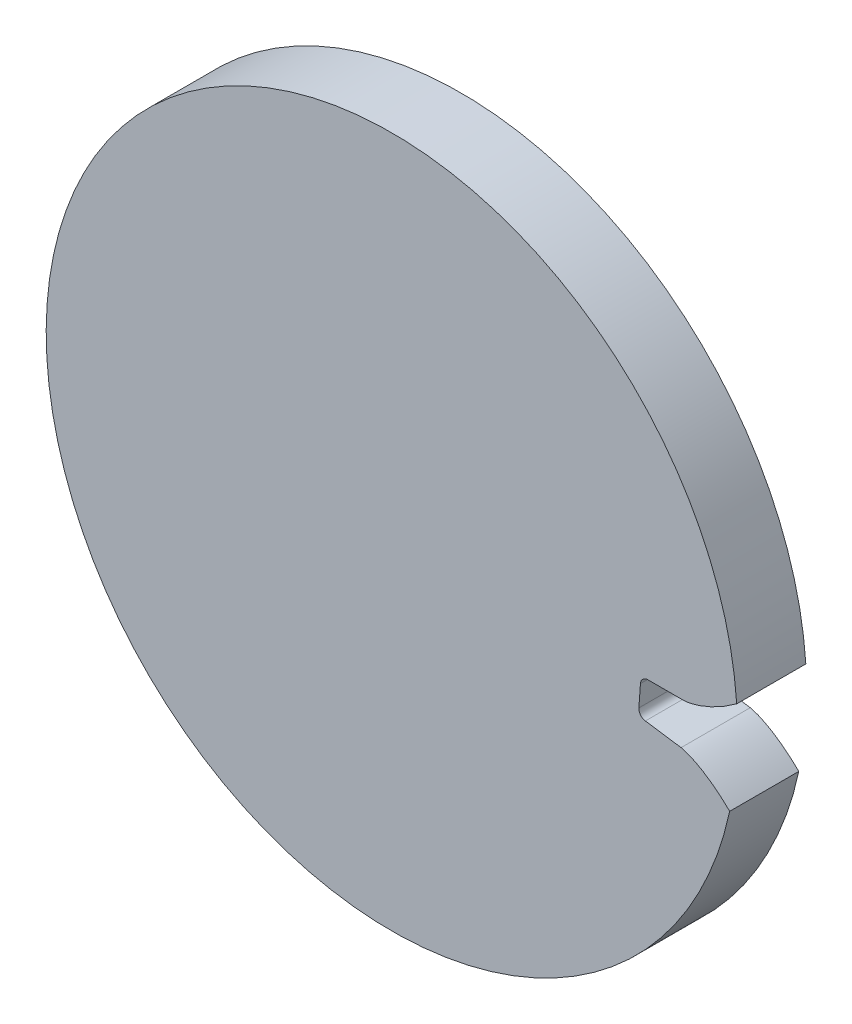
ISO-10303-21;
HEADER;
FILE_DESCRIPTION(('STEP AP214'),'2;1');
FILE_NAME('part.step','',(''),(''),'','','');
FILE_SCHEMA(('AUTOMOTIVE_DESIGN { 1 0 10303 214 1 1 1 1 }'));
ENDSEC;
DATA;
#1=APPLICATION_CONTEXT('core data for automotive mechanical design processes');
#2=APPLICATION_PROTOCOL_DEFINITION('international standard','automotive_design',2000,#1);
#3=PRODUCT_CONTEXT('',#1,'mechanical');
#4=PRODUCT('Part','Part','',(#3));
#5=PRODUCT_RELATED_PRODUCT_CATEGORY('part','',(#4));
#6=PRODUCT_DEFINITION_FORMATION('','',#4);
#7=PRODUCT_DEFINITION_CONTEXT('part definition',#1,'design');
#8=PRODUCT_DEFINITION('design','',#6,#7);
#9=PRODUCT_DEFINITION_SHAPE('','',#8);
#10=(LENGTH_UNIT() NAMED_UNIT(*) SI_UNIT(.MILLI.,.METRE.));
#11=(NAMED_UNIT(*) PLANE_ANGLE_UNIT() SI_UNIT($,.RADIAN.));
#12=(NAMED_UNIT(*) SI_UNIT($,.STERADIAN.) SOLID_ANGLE_UNIT());
#13=UNCERTAINTY_MEASURE_WITH_UNIT(LENGTH_MEASURE(1.E-05),#10,'distance_accuracy_value','');
#14=(GEOMETRIC_REPRESENTATION_CONTEXT(3) GLOBAL_UNCERTAINTY_ASSIGNED_CONTEXT((#13)) GLOBAL_UNIT_ASSIGNED_CONTEXT((#10,
#11,#12)) REPRESENTATION_CONTEXT('',''));
#15=CARTESIAN_POINT('',(0.,0.,0.));
#16=DIRECTION('',(0.,0.,1.));
#17=DIRECTION('',(1.,0.,0.));
#18=AXIS2_PLACEMENT_3D('',#15,#16,#17);
#19=CARTESIAN_POINT('',(0.,0.,10.));
#20=DIRECTION('',(0.,0.,-1.));
#21=DIRECTION('',(-1.,0.,0.));
#22=AXIS2_PLACEMENT_3D('',#19,#20,#21);
#23=CYLINDRICAL_SURFACE('',#22,50.);
#24=DIRECTION('',(0.,0.,-1.));
#25=VECTOR('',#24,1.);
#26=CARTESIAN_POINT('',(49.8841416127494,3.40182532755021,187.218085984473));
#27=LINE('',#26,#25);
#28=CARTESIAN_POINT('',(49.8841416127494,3.40182532755021,0.));
#29=VERTEX_POINT('',#28);
#30=CARTESIAN_POINT('',(49.8841416127494,3.40182532755021,10.));
#31=VERTEX_POINT('',#30);
#32=EDGE_CURVE('E142',#29,#31,#27,.F.);
#33=ORIENTED_EDGE('',*,*,#32,.F.);
#34=CARTESIAN_POINT('',(0.,0.,0.));
#35=DIRECTION('',(0.,0.,1.));
#36=DIRECTION('',(1.,0.,0.));
#37=AXIS2_PLACEMENT_3D('',#34,#35,#36);
#38=CIRCLE('',#37,50.);
#39=CARTESIAN_POINT('',(48.8720296298414,-10.5605264953935,0.));
#40=VERTEX_POINT('',#39);
#41=EDGE_CURVE('E149',#29,#40,#38,.T.);
#42=ORIENTED_EDGE('',*,*,#41,.T.);
#43=DIRECTION('',(0.,0.,-1.));
#44=VECTOR('',#43,1.);
#45=CARTESIAN_POINT('',(48.8720296298414,-10.5605264953935,187.218085984473));
#46=LINE('',#45,#44);
#47=CARTESIAN_POINT('',(48.8720296298414,-10.5605264953935,10.));
#48=VERTEX_POINT('',#47);
#49=EDGE_CURVE('E113',#48,#40,#46,.T.);
#50=ORIENTED_EDGE('',*,*,#49,.F.);
#51=CARTESIAN_POINT('',(0.,0.,10.));
#52=DIRECTION('',(0.,0.,1.));
#53=DIRECTION('',(1.,0.,0.));
#54=AXIS2_PLACEMENT_3D('',#51,#52,#53);
#55=CIRCLE('',#54,50.);
#56=EDGE_CURVE('E114',#31,#48,#55,.T.);
#57=ORIENTED_EDGE('',*,*,#56,.F.);
#58=EDGE_LOOP('',(#33,#42,#50,#57));
#59=FACE_BOUND('',#58,.T.);
#60=ADVANCED_FACE('F36',(#59),#23,.T.);
#61=CARTESIAN_POINT('',(0.,0.,10.));
#62=DIRECTION('',(0.,0.,1.));
#63=DIRECTION('',(1.,0.,0.));
#64=AXIS2_PLACEMENT_3D('',#61,#62,#63);
#65=PLANE('',#64);
#66=DIRECTION('',(0.0722989440285444,0.99738300702005,0.));
#67=VECTOR('',#66,1.);
#68=CARTESIAN_POINT('',(35.8478019375264,-2.59855863553475,10.));
#69=LINE('',#68,#67);
#70=CARTESIAN_POINT('',(35.7334085127845,-4.17664610950091,10.));
#71=VERTEX_POINT('',#70);
#72=CARTESIAN_POINT('',(35.9621953622684,-1.0204711615686,10.));
#73=VERTEX_POINT('',#72);
#74=EDGE_CURVE('E137',#71,#73,#69,.T.);
#75=ORIENTED_EDGE('',*,*,#74,.T.);
#76=CARTESIAN_POINT('',(37.0593166699904,-1.1,10.));
#77=DIRECTION('',(0.,0.,1.));
#78=DIRECTION('',(1.,0.,0.));
#79=AXIS2_PLACEMENT_3D('',#76,#77,#78);
#80=CIRCLE('',#79,1.1);
#81=CARTESIAN_POINT('',(37.0593166699904,0.,10.));
#82=VERTEX_POINT('',#81);
#83=EDGE_CURVE('E184',#73,#82,#80,.F.);
#84=ORIENTED_EDGE('',*,*,#83,.T.);
#85=DIRECTION('',(1.,0.,0.));
#86=VECTOR('',#85,1.);
#87=CARTESIAN_POINT('',(0.,0.,10.));
#88=LINE('',#87,#86);
#89=CARTESIAN_POINT('',(42.2861679353659,0.,10.));
#90=VERTEX_POINT('',#89);
#91=EDGE_CURVE('E140',#82,#90,#88,.T.);
#92=ORIENTED_EDGE('',*,*,#91,.T.);
#93=CARTESIAN_POINT('',(50.9612588059714,4.23045942459239,9.99999999999998));
#94=CARTESIAN_POINT('',(50.85723984252,4.14634330656732,9.99999999999998));
#95=CARTESIAN_POINT('',(50.6529209842346,3.98370108218934,9.99999999999998));
#96=CARTESIAN_POINT('',(50.2311964455083,3.65440670119934,9.99999999999998));
#97=CARTESIAN_POINT('',(49.8168921151114,3.35125795211907,9.99999999999998));
#98=CARTESIAN_POINT('',(49.3009809273701,2.98272523518514,9.99999999999998));
#99=CARTESIAN_POINT('',(48.8341362067108,2.67125406879334,9.99999999999998));
#100=CARTESIAN_POINT('',(48.3251005992351,2.34371293883012,9.99999999999998));
#101=CARTESIAN_POINT('',(47.8292418842842,2.04561700778615,9.99999999999998));
#102=CARTESIAN_POINT('',(47.3127913543987,1.7504942085061,9.99999999999998));
#103=CARTESIAN_POINT('',(46.7963261869858,1.47593892801398,9.99999999999998));
#104=CARTESIAN_POINT('',(46.267095665426,1.2127471984947,9.99999999999998));
#105=CARTESIAN_POINT('',(45.7428627892581,0.973159705968336,9.99999999999998));
#106=CARTESIAN_POINT('',(45.2768411682158,0.777725040874557,9.99999999999998));
#107=CARTESIAN_POINT('',(44.8751974436518,0.623574822890523,9.99999999999998));
#108=CARTESIAN_POINT('',(44.5384602683943,0.503808988977582,9.99999999999998));
#109=CARTESIAN_POINT('',(44.2592470212459,0.411205938210846,9.99999999999998));
#110=CARTESIAN_POINT('',(43.9778050990059,0.324724196878738,9.99999999999998));
#111=CARTESIAN_POINT('',(43.6944800374654,0.245219325625752,9.99999999999998));
#112=CARTESIAN_POINT('',(43.4093306290313,0.173277309926937,9.99999999999998));
#113=CARTESIAN_POINT('',(43.1461639638186,0.115211018516014,9.99999999999998));
#114=CARTESIAN_POINT('',(42.9058497834109,0.0697901262934091,9.99999999999998));
#115=CARTESIAN_POINT('',(42.7012199464152,0.0378529474281408,9.99999999999998));
#116=CARTESIAN_POINT('',(42.5425266205627,0.017843628470022,9.99999999999998));
#117=CARTESIAN_POINT('',(42.4177358491565,0.00629879076231466,9.99999999999998));
#118=CARTESIAN_POINT('',(42.3411580577492,0.00143532278083627,9.99999999999998));
#119=CARTESIAN_POINT('',(42.3006236252328,0.000207971910645951,9.99999999999998));
#120=CARTESIAN_POINT('',(42.2861679353659,0.,9.99999999999998));
#121=B_SPLINE_CURVE_WITH_KNOTS('',4,(#93,#94,#95,#96,#97,#98,#99,#100,#101,#102,#103,#104,#105,
#106,#107,#108,#109,#110,#111,#112,#113,#114,#115,#116,#117,#118,#119,#120),.UNSPECIFIED.,.F.,
.F.,(5,1,1,1,1,1,1,1,1,1,1,1,1,1,1,1,1,1,1,1,1,1,1,1,5),(0.,0.0547325071981258,
0.109464832515972,0.164197226706385,0.218929527548083,0.273661932532587,0.328394299235392,
0.383126632850258,0.437858978089534,0.492591254063469,0.547323563010603,0.602055882616382,
0.652783569591155,0.680149901589091,0.707515959151841,0.734882060894262,0.762248419012878,
0.789614738913551,0.816980389294142,0.844236065513628,0.862480775228939,0.880559094587625,
0.894007226611462,0.903714166155198,0.909090914781342),.UNSPECIFIED.);
#122=EDGE_CURVE('E145',#90,#31,#121,.F.);
#123=ORIENTED_EDGE('',*,*,#122,.T.);
#124=ORIENTED_EDGE('',*,*,#56,.T.);
#125=CARTESIAN_POINT('',(41.8440967233415,-6.09848899856406,10.));
#126=CARTESIAN_POINT('',(41.8583712958568,-6.10077958830284,10.));
#127=CARTESIAN_POINT('',(41.8983049623839,-6.10783996274356,10.));
#128=CARTESIAN_POINT('',(41.9733807817262,-6.12369659567595,10.));
#129=CARTESIAN_POINT('',(42.095201965687,-6.1531180001912,10.));
#130=CARTESIAN_POINT('',(42.2493505344306,-6.19580480459692,10.));
#131=CARTESIAN_POINT('',(42.4472351516999,-6.25691971137064,10.));
#132=CARTESIAN_POINT('',(42.67848644438,-6.33652374638278,10.));
#133=CARTESIAN_POINT('',(42.9305276028592,-6.43193675549968,10.));
#134=CARTESIAN_POINT('',(43.2023205412377,-6.5442507679903,10.));
#135=CARTESIAN_POINT('',(43.4712174938751,-6.66378546551173,10.));
#136=CARTESIAN_POINT('',(43.7372447935193,-6.78995250963319,10.));
#137=CARTESIAN_POINT('',(44.0001839052108,-6.92185545098433,10.));
#138=CARTESIAN_POINT('',(44.3161281717079,-7.08893327907979,10.));
#139=CARTESIAN_POINT('',(44.6913415387532,-7.29939681600869,10.));
#140=CARTESIAN_POINT('',(45.1243057567224,-7.55999774762148,10.));
#141=CARTESIAN_POINT('',(45.6085049757168,-7.8726851176189,10.));
#142=CARTESIAN_POINT('',(46.0942454026453,-8.20945071723499,10.));
#143=CARTESIAN_POINT('',(46.5657150825739,-8.55562005745053,10.));
#144=CARTESIAN_POINT('',(47.0342040412087,-8.92213978694769,10.));
#145=CARTESIAN_POINT('',(47.4818876738916,-9.28863182550511,10.));
#146=CARTESIAN_POINT('',(47.9383638730752,-9.6861615993265,10.));
#147=CARTESIAN_POINT('',(48.3554078622914,-10.0617046617832,10.));
#148=CARTESIAN_POINT('',(48.812775977327,-10.5007890778541,10.));
#149=CARTESIAN_POINT('',(49.1790291026159,-10.860519380262,10.));
#150=CARTESIAN_POINT('',(49.5488541539952,-11.2471921195237,10.));
#151=CARTESIAN_POINT('',(49.7275808303868,-11.4376007961843,10.));
#152=CARTESIAN_POINT('',(49.8183811685307,-11.5358391016565,10.));
#153=B_SPLINE_CURVE_WITH_KNOTS('',4,(#125,#126,#127,#128,#129,#130,#131,#132,#133,#134,#135,
#136,#137,#138,#139,#140,#141,#142,#143,#144,#145,#146,#147,#148,#149,#150,#151,#152),
.UNSPECIFIED.,.F.,.F.,(5,1,1,1,1,1,1,1,1,1,1,1,1,1,1,1,1,1,1,1,1,1,1,1,5),(0.,
0.00537674862614504,0.0150836881698806,0.0285318201937173,0.0466101395524021,0.0648548492677142,
0.0921105254871995,0.119476175867791,0.146842495768464,0.174208853887078,0.201574955629501,
0.228941013192252,0.256307345190187,0.307035032164959,0.361767351770738,0.416499660717872,
0.471231936691808,0.525964281931083,0.580696615545949,0.635428982248754,0.690161387233256,
0.744893688074954,0.799626082265366,0.854358407583213,0.909090914781339),.UNSPECIFIED.);
#154=CARTESIAN_POINT('',(41.8440967233415,-6.09848899856406,10.));
#155=VERTEX_POINT('',#154);
#156=EDGE_CURVE('E129',#48,#155,#153,.F.);
#157=ORIENTED_EDGE('',*,*,#156,.T.);
#158=DIRECTION('',(-0.989545725384715,0.144219476399128,0.));
#159=VECTOR('',#158,1.);
#160=CARTESIAN_POINT('',(0.,0.,10.));
#161=LINE('',#160,#159);
#162=CARTESIAN_POINT('',(36.6718883964675,-5.34467524585549,10.));
#163=VERTEX_POINT('',#162);
#164=EDGE_CURVE('E117',#155,#163,#161,.T.);
#165=ORIENTED_EDGE('',*,*,#164,.T.);
#166=CARTESIAN_POINT('',(36.8305298205066,-4.25617494793231,10.));
#167=DIRECTION('',(0.,0.,1.));
#168=DIRECTION('',(1.,0.,0.));
#169=AXIS2_PLACEMENT_3D('',#166,#167,#168);
#170=CIRCLE('',#169,1.1);
#171=EDGE_CURVE('E11',#163,#71,#170,.F.);
#172=ORIENTED_EDGE('',*,*,#171,.T.);
#173=EDGE_LOOP('',(#75,#84,#92,#123,#124,#157,#165,#172));
#174=FACE_BOUND('',#173,.T.);
#175=ADVANCED_FACE('F188',(#174),#65,.T.);
#176=CARTESIAN_POINT('',(0.,0.,0.));
#177=DIRECTION('',(0.,0.,1.));
#178=DIRECTION('',(1.,0.,0.));
#179=AXIS2_PLACEMENT_3D('',#176,#177,#178);
#180=PLANE('',#179);
#181=CARTESIAN_POINT('',(50.9612588059714,4.23045942459239,0.));
#182=CARTESIAN_POINT('',(50.85723984252,4.14634330656732,0.));
#183=CARTESIAN_POINT('',(50.6529209842346,3.98370108218934,0.));
#184=CARTESIAN_POINT('',(50.2311964455083,3.65440670119934,0.));
#185=CARTESIAN_POINT('',(49.8168921151114,3.35125795211907,0.));
#186=CARTESIAN_POINT('',(49.3009809273701,2.98272523518514,0.));
#187=CARTESIAN_POINT('',(48.8341362067108,2.67125406879334,0.));
#188=CARTESIAN_POINT('',(48.3251005992351,2.34371293883012,0.));
#189=CARTESIAN_POINT('',(47.8292418842842,2.04561700778615,0.));
#190=CARTESIAN_POINT('',(47.3127913543987,1.7504942085061,0.));
#191=CARTESIAN_POINT('',(46.7963261869858,1.47593892801398,0.));
#192=CARTESIAN_POINT('',(46.267095665426,1.2127471984947,0.));
#193=CARTESIAN_POINT('',(45.7428627892581,0.973159705968336,0.));
#194=CARTESIAN_POINT('',(45.2768411682158,0.777725040874557,0.));
#195=CARTESIAN_POINT('',(44.8751974436518,0.623574822890523,0.));
#196=CARTESIAN_POINT('',(44.5384602683943,0.503808988977582,0.));
#197=CARTESIAN_POINT('',(44.2592470212459,0.411205938210846,0.));
#198=CARTESIAN_POINT('',(43.9778050990059,0.324724196878738,0.));
#199=CARTESIAN_POINT('',(43.6944800374654,0.245219325625752,0.));
#200=CARTESIAN_POINT('',(43.4093306290313,0.173277309926937,0.));
#201=CARTESIAN_POINT('',(43.1461639638186,0.115211018516014,0.));
#202=CARTESIAN_POINT('',(42.9058497834109,0.0697901262934091,0.));
#203=CARTESIAN_POINT('',(42.7012199464152,0.0378529474281408,0.));
#204=CARTESIAN_POINT('',(42.5425266205627,0.017843628470022,0.));
#205=CARTESIAN_POINT('',(42.4177358491565,0.00629879076231466,0.));
#206=CARTESIAN_POINT('',(42.3411580577492,0.00143532278083627,0.));
#207=CARTESIAN_POINT('',(42.3006236252328,0.000207971910645951,0.));
#208=CARTESIAN_POINT('',(42.2861679353659,0.,0.));
#209=B_SPLINE_CURVE_WITH_KNOTS('',4,(#181,#182,#183,#184,#185,#186,#187,#188,#189,#190,#191,
#192,#193,#194,#195,#196,#197,#198,#199,#200,#201,#202,#203,#204,#205,#206,#207,#208),
.UNSPECIFIED.,.F.,.F.,(5,1,1,1,1,1,1,1,1,1,1,1,1,1,1,1,1,1,1,1,1,1,1,1,5),(0.,
0.0547325071981258,0.109464832515972,0.164197226706385,0.218929527548083,0.273661932532587,
0.328394299235392,0.383126632850258,0.437858978089534,0.492591254063469,0.547323563010603,
0.602055882616382,0.652783569591155,0.680149901589091,0.707515959151841,0.734882060894262,
0.762248419012878,0.789614738913551,0.816980389294142,0.844236065513628,0.862480775228939,
0.880559094587625,0.894007226611462,0.903714166155198,0.909090914781342),.UNSPECIFIED.);
#210=CARTESIAN_POINT('',(42.2861679353659,0.,0.));
#211=VERTEX_POINT('',#210);
#212=EDGE_CURVE('E165',#211,#29,#209,.F.);
#213=ORIENTED_EDGE('',*,*,#212,.F.);
#214=DIRECTION('',(1.,0.,0.));
#215=VECTOR('',#214,1.);
#216=CARTESIAN_POINT('',(0.,0.,0.));
#217=LINE('',#216,#215);
#218=CARTESIAN_POINT('',(37.0593166699904,0.,0.));
#219=VERTEX_POINT('',#218);
#220=EDGE_CURVE('E163',#219,#211,#217,.T.);
#221=ORIENTED_EDGE('',*,*,#220,.F.);
#222=CARTESIAN_POINT('',(37.0593166699904,-1.1,0.));
#223=DIRECTION('',(0.,0.,1.));
#224=DIRECTION('',(1.,0.,0.));
#225=AXIS2_PLACEMENT_3D('',#222,#223,#224);
#226=CIRCLE('',#225,1.1);
#227=CARTESIAN_POINT('',(35.9621953622684,-1.0204711615686,0.));
#228=VERTEX_POINT('',#227);
#229=EDGE_CURVE('E182',#219,#228,#226,.T.);
#230=ORIENTED_EDGE('',*,*,#229,.T.);
#231=DIRECTION('',(0.0722989440285444,0.99738300702005,0.));
#232=VECTOR('',#231,1.);
#233=CARTESIAN_POINT('',(35.8478019375264,-2.59855863553475,0.));
#234=LINE('',#233,#232);
#235=CARTESIAN_POINT('',(35.7334085127845,-4.17664610950091,0.));
#236=VERTEX_POINT('',#235);
#237=EDGE_CURVE('E105',#236,#228,#234,.T.);
#238=ORIENTED_EDGE('',*,*,#237,.F.);
#239=CARTESIAN_POINT('',(36.8305298205066,-4.25617494793231,0.));
#240=DIRECTION('',(0.,0.,1.));
#241=DIRECTION('',(1.,0.,0.));
#242=AXIS2_PLACEMENT_3D('',#239,#240,#241);
#243=CIRCLE('',#242,1.1);
#244=CARTESIAN_POINT('',(36.6718883964675,-5.34467524585549,0.));
#245=VERTEX_POINT('',#244);
#246=EDGE_CURVE('E44',#236,#245,#243,.T.);
#247=ORIENTED_EDGE('',*,*,#246,.T.);
#248=DIRECTION('',(-0.989545725384715,0.144219476399128,0.));
#249=VECTOR('',#248,1.);
#250=CARTESIAN_POINT('',(0.,0.,0.));
#251=LINE('',#250,#249);
#252=CARTESIAN_POINT('',(41.8440967233415,-6.09848899856406,0.));
#253=VERTEX_POINT('',#252);
#254=EDGE_CURVE('E97',#253,#245,#251,.T.);
#255=ORIENTED_EDGE('',*,*,#254,.F.);
#256=CARTESIAN_POINT('',(41.8440967233415,-6.09848899856406,0.));
#257=CARTESIAN_POINT('',(41.8583712958568,-6.10077958830284,0.));
#258=CARTESIAN_POINT('',(41.8983049623839,-6.10783996274356,0.));
#259=CARTESIAN_POINT('',(41.9733807817262,-6.12369659567595,0.));
#260=CARTESIAN_POINT('',(42.095201965687,-6.1531180001912,0.));
#261=CARTESIAN_POINT('',(42.2493505344306,-6.19580480459692,0.));
#262=CARTESIAN_POINT('',(42.4472351516999,-6.25691971137064,0.));
#263=CARTESIAN_POINT('',(42.67848644438,-6.33652374638278,0.));
#264=CARTESIAN_POINT('',(42.9305276028592,-6.43193675549968,0.));
#265=CARTESIAN_POINT('',(43.2023205412377,-6.5442507679903,0.));
#266=CARTESIAN_POINT('',(43.4712174938751,-6.66378546551173,0.));
#267=CARTESIAN_POINT('',(43.7372447935193,-6.78995250963319,0.));
#268=CARTESIAN_POINT('',(44.0001839052108,-6.92185545098433,0.));
#269=CARTESIAN_POINT('',(44.3161281717079,-7.08893327907979,0.));
#270=CARTESIAN_POINT('',(44.6913415387532,-7.29939681600869,0.));
#271=CARTESIAN_POINT('',(45.1243057567224,-7.55999774762148,0.));
#272=CARTESIAN_POINT('',(45.6085049757168,-7.8726851176189,0.));
#273=CARTESIAN_POINT('',(46.0942454026453,-8.20945071723499,0.));
#274=CARTESIAN_POINT('',(46.5657150825739,-8.55562005745053,0.));
#275=CARTESIAN_POINT('',(47.0342040412087,-8.92213978694769,0.));
#276=CARTESIAN_POINT('',(47.4818876738916,-9.28863182550511,0.));
#277=CARTESIAN_POINT('',(47.9383638730752,-9.6861615993265,0.));
#278=CARTESIAN_POINT('',(48.3554078622914,-10.0617046617832,0.));
#279=CARTESIAN_POINT('',(48.812775977327,-10.5007890778541,0.));
#280=CARTESIAN_POINT('',(49.1790291026159,-10.860519380262,0.));
#281=CARTESIAN_POINT('',(49.5488541539952,-11.2471921195237,0.));
#282=CARTESIAN_POINT('',(49.7275808303868,-11.4376007961843,0.));
#283=CARTESIAN_POINT('',(49.8183811685307,-11.5358391016565,0.));
#284=B_SPLINE_CURVE_WITH_KNOTS('',4,(#256,#257,#258,#259,#260,#261,#262,#263,#264,#265,#266,
#267,#268,#269,#270,#271,#272,#273,#274,#275,#276,#277,#278,#279,#280,#281,#282,#283),
.UNSPECIFIED.,.F.,.F.,(5,1,1,1,1,1,1,1,1,1,1,1,1,1,1,1,1,1,1,1,1,1,1,1,5),(0.,
0.00537674862614504,0.0150836881698806,0.0285318201937173,0.0466101395524021,0.0648548492677142,
0.0921105254871995,0.119476175867791,0.146842495768464,0.174208853887078,0.201574955629501,
0.228941013192252,0.256307345190187,0.307035032164959,0.361767351770738,0.416499660717872,
0.471231936691808,0.525964281931083,0.580696615545949,0.635428982248754,0.690161387233256,
0.744893688074954,0.799626082265366,0.854358407583213,0.909090914781339),.UNSPECIFIED.);
#285=EDGE_CURVE('E102',#40,#253,#284,.F.);
#286=ORIENTED_EDGE('',*,*,#285,.F.);
#287=ORIENTED_EDGE('',*,*,#41,.F.);
#288=EDGE_LOOP('',(#213,#221,#230,#238,#247,#255,#286,#287));
#289=FACE_BOUND('',#288,.T.);
#290=ADVANCED_FACE('F100',(#289),#180,.F.);
#291=CARTESIAN_POINT('',(42.2861679353659,0.,187.218085984473));
#292=DIRECTION('',(0.,-1.,0.));
#293=DIRECTION('',(0.,0.,-1.));
#294=AXIS2_PLACEMENT_3D('',#291,#292,#293);
#295=PLANE('',#294);
#296=ORIENTED_EDGE('',*,*,#91,.F.);
#297=DIRECTION('',(0.,0.,-1.));
#298=VECTOR('',#297,1.);
#299=CARTESIAN_POINT('',(37.0593166699904,0.,0.));
#300=LINE('',#299,#298);
#301=EDGE_CURVE('E170',#82,#219,#300,.T.);
#302=ORIENTED_EDGE('',*,*,#301,.T.);
#303=ORIENTED_EDGE('',*,*,#220,.T.);
#304=DIRECTION('',(0.,0.,-1.));
#305=VECTOR('',#304,1.);
#306=CARTESIAN_POINT('',(42.2861679353659,0.,187.218085984473));
#307=LINE('',#306,#305);
#308=EDGE_CURVE('E118',#90,#211,#307,.T.);
#309=ORIENTED_EDGE('',*,*,#308,.F.);
#310=EDGE_LOOP('',(#296,#302,#303,#309));
#311=FACE_BOUND('',#310,.T.);
#312=ADVANCED_FACE('F196',(#311),#295,.T.);
#313=CARTESIAN_POINT('',(35.659435939687,-5.19711727106951,187.218085984473));
#314=DIRECTION('',(0.99738300702005,-0.0722989440285444,0.));
#315=DIRECTION('',(0.0722989440285444,0.99738300702005,0.));
#316=AXIS2_PLACEMENT_3D('',#313,#314,#315);
#317=PLANE('',#316);
#318=ORIENTED_EDGE('',*,*,#237,.T.);
#319=DIRECTION('',(0.,0.,-1.));
#320=VECTOR('',#319,1.);
#321=CARTESIAN_POINT('',(35.9621953622684,-1.0204711615686,10.));
#322=LINE('',#321,#320);
#323=EDGE_CURVE('E179',#228,#73,#322,.F.);
#324=ORIENTED_EDGE('',*,*,#323,.T.);
#325=ORIENTED_EDGE('',*,*,#74,.F.);
#326=DIRECTION('',(0.,0.,-1.));
#327=VECTOR('',#326,1.);
#328=CARTESIAN_POINT('',(35.7334085127845,-4.17664610950091,0.));
#329=LINE('',#328,#327);
#330=EDGE_CURVE('E176',#71,#236,#329,.T.);
#331=ORIENTED_EDGE('',*,*,#330,.T.);
#332=EDGE_LOOP('',(#318,#324,#325,#331));
#333=FACE_BOUND('',#332,.T.);
#334=ADVANCED_FACE('F200',(#333),#317,.T.);
#335=CARTESIAN_POINT('',(41.8440967233415,-6.09848899856406,187.218085984473));
#336=DIRECTION('',(0.144219476399128,0.989545725384715,0.));
#337=DIRECTION('',(-0.989545725384715,0.144219476399128,0.));
#338=AXIS2_PLACEMENT_3D('',#335,#336,#337);
#339=PLANE('',#338);
#340=ORIENTED_EDGE('',*,*,#254,.T.);
#341=DIRECTION('',(0.,0.,-1.));
#342=VECTOR('',#341,1.);
#343=CARTESIAN_POINT('',(36.6718883964675,-5.34467524585549,10.));
#344=LINE('',#343,#342);
#345=EDGE_CURVE('E57',#245,#163,#344,.F.);
#346=ORIENTED_EDGE('',*,*,#345,.T.);
#347=ORIENTED_EDGE('',*,*,#164,.F.);
#348=DIRECTION('',(0.,0.,-1.));
#349=VECTOR('',#348,1.);
#350=CARTESIAN_POINT('',(41.8440967233415,-6.09848899856406,187.218085984473));
#351=LINE('',#350,#349);
#352=EDGE_CURVE('E112',#155,#253,#351,.T.);
#353=ORIENTED_EDGE('',*,*,#352,.T.);
#354=EDGE_LOOP('',(#340,#346,#347,#353));
#355=FACE_BOUND('',#354,.T.);
#356=ADVANCED_FACE('F116',(#355),#339,.T.);
#357=CARTESIAN_POINT('',(50.9612588059714,4.23045942459239,187.218085984473));
#358=CARTESIAN_POINT('',(50.85723984252,4.14634330656732,187.218085984473));
#359=CARTESIAN_POINT('',(50.6529209842346,3.98370108218934,187.218085984473));
#360=CARTESIAN_POINT('',(50.2311964455083,3.65440670119934,187.218085984473));
#361=CARTESIAN_POINT('',(49.8168921151114,3.35125795211907,187.218085984473));
#362=CARTESIAN_POINT('',(49.3009809273701,2.98272523518514,187.218085984473));
#363=CARTESIAN_POINT('',(48.8341362067108,2.67125406879334,187.218085984473));
#364=CARTESIAN_POINT('',(48.3251005992351,2.34371293883012,187.218085984473));
#365=CARTESIAN_POINT('',(47.8292418842842,2.04561700778615,187.218085984473));
#366=CARTESIAN_POINT('',(47.3127913543987,1.7504942085061,187.218085984473));
#367=CARTESIAN_POINT('',(46.7963261869858,1.47593892801398,187.218085984473));
#368=CARTESIAN_POINT('',(46.267095665426,1.2127471984947,187.218085984473));
#369=CARTESIAN_POINT('',(45.7428627892581,0.973159705968336,187.218085984473));
#370=CARTESIAN_POINT('',(45.2768411682158,0.777725040874557,187.218085984473));
#371=CARTESIAN_POINT('',(44.8751974436518,0.623574822890523,187.218085984473));
#372=CARTESIAN_POINT('',(44.5384602683943,0.503808988977582,187.218085984473));
#373=CARTESIAN_POINT('',(44.2592470212459,0.411205938210846,187.218085984473));
#374=CARTESIAN_POINT('',(43.9778050990059,0.324724196878738,187.218085984473));
#375=CARTESIAN_POINT('',(43.6944800374654,0.245219325625752,187.218085984473));
#376=CARTESIAN_POINT('',(43.4093306290313,0.173277309926937,187.218085984473));
#377=CARTESIAN_POINT('',(43.1461639638186,0.115211018516014,187.218085984473));
#378=CARTESIAN_POINT('',(42.9058497834109,0.0697901262934091,187.218085984473));
#379=CARTESIAN_POINT('',(42.7012199464152,0.0378529474281408,187.218085984473));
#380=CARTESIAN_POINT('',(42.5425266205627,0.017843628470022,187.218085984473));
#381=CARTESIAN_POINT('',(42.4177358491565,0.00629879076231466,187.218085984473));
#382=CARTESIAN_POINT('',(42.3411580577492,0.00143532278083627,187.218085984473));
#383=CARTESIAN_POINT('',(42.3006236252328,0.000207971910645951,187.218085984473));
#384=CARTESIAN_POINT('',(42.2861679353659,0.,187.218085984473));
#385=B_SPLINE_CURVE_WITH_KNOTS('',4,(#357,#358,#359,#360,#361,#362,#363,#364,#365,#366,#367,
#368,#369,#370,#371,#372,#373,#374,#375,#376,#377,#378,#379,#380,#381,#382,#383,#384),
.UNSPECIFIED.,.F.,.F.,(5,1,1,1,1,1,1,1,1,1,1,1,1,1,1,1,1,1,1,1,1,1,1,1,5),(0.,
0.0547325071981258,0.109464832515972,0.164197226706385,0.218929527548083,0.273661932532587,
0.328394299235392,0.383126632850258,0.437858978089534,0.492591254063469,0.547323563010603,
0.602055882616382,0.652783569591155,0.680149901589091,0.707515959151841,0.734882060894262,
0.762248419012878,0.789614738913551,0.816980389294142,0.844236065513628,0.862480775228939,
0.880559094587625,0.894007226611462,0.903714166155198,0.909090914781342),.UNSPECIFIED.);
#386=DIRECTION('',(0.,0.,-1.));
#387=VECTOR('',#386,1.);
#388=SURFACE_OF_LINEAR_EXTRUSION('',#385,#387);
#389=ORIENTED_EDGE('',*,*,#122,.F.);
#390=ORIENTED_EDGE('',*,*,#308,.T.);
#391=ORIENTED_EDGE('',*,*,#212,.T.);
#392=ORIENTED_EDGE('',*,*,#32,.T.);
#393=EDGE_LOOP('',(#389,#390,#391,#392));
#394=FACE_BOUND('',#393,.T.);
#395=ADVANCED_FACE('F207',(#394),#388,.T.);
#396=CARTESIAN_POINT('',(41.8440967233415,-6.09848899856406,187.218085984473));
#397=CARTESIAN_POINT('',(41.8583712958568,-6.10077958830284,187.218085984473));
#398=CARTESIAN_POINT('',(41.8983049623839,-6.10783996274356,187.218085984473));
#399=CARTESIAN_POINT('',(41.9733807817262,-6.12369659567595,187.218085984473));
#400=CARTESIAN_POINT('',(42.095201965687,-6.1531180001912,187.218085984473));
#401=CARTESIAN_POINT('',(42.2493505344306,-6.19580480459692,187.218085984473));
#402=CARTESIAN_POINT('',(42.4472351516999,-6.25691971137064,187.218085984473));
#403=CARTESIAN_POINT('',(42.67848644438,-6.33652374638278,187.218085984473));
#404=CARTESIAN_POINT('',(42.9305276028592,-6.43193675549968,187.218085984473));
#405=CARTESIAN_POINT('',(43.2023205412377,-6.5442507679903,187.218085984473));
#406=CARTESIAN_POINT('',(43.4712174938751,-6.66378546551173,187.218085984473));
#407=CARTESIAN_POINT('',(43.7372447935193,-6.78995250963319,187.218085984473));
#408=CARTESIAN_POINT('',(44.0001839052108,-6.92185545098433,187.218085984473));
#409=CARTESIAN_POINT('',(44.3161281717079,-7.08893327907979,187.218085984473));
#410=CARTESIAN_POINT('',(44.6913415387532,-7.29939681600869,187.218085984473));
#411=CARTESIAN_POINT('',(45.1243057567224,-7.55999774762148,187.218085984473));
#412=CARTESIAN_POINT('',(45.6085049757168,-7.8726851176189,187.218085984473));
#413=CARTESIAN_POINT('',(46.0942454026453,-8.20945071723499,187.218085984473));
#414=CARTESIAN_POINT('',(46.5657150825739,-8.55562005745053,187.218085984473));
#415=CARTESIAN_POINT('',(47.0342040412087,-8.92213978694769,187.218085984473));
#416=CARTESIAN_POINT('',(47.4818876738916,-9.28863182550511,187.218085984473));
#417=CARTESIAN_POINT('',(47.9383638730752,-9.6861615993265,187.218085984473));
#418=CARTESIAN_POINT('',(48.3554078622914,-10.0617046617832,187.218085984473));
#419=CARTESIAN_POINT('',(48.812775977327,-10.5007890778541,187.218085984473));
#420=CARTESIAN_POINT('',(49.1790291026159,-10.860519380262,187.218085984473));
#421=CARTESIAN_POINT('',(49.5488541539952,-11.2471921195237,187.218085984473));
#422=CARTESIAN_POINT('',(49.7275808303868,-11.4376007961843,187.218085984473));
#423=CARTESIAN_POINT('',(49.8183811685307,-11.5358391016565,187.218085984473));
#424=B_SPLINE_CURVE_WITH_KNOTS('',4,(#396,#397,#398,#399,#400,#401,#402,#403,#404,#405,#406,
#407,#408,#409,#410,#411,#412,#413,#414,#415,#416,#417,#418,#419,#420,#421,#422,#423),
.UNSPECIFIED.,.F.,.F.,(5,1,1,1,1,1,1,1,1,1,1,1,1,1,1,1,1,1,1,1,1,1,1,1,5),(0.,
0.00537674862614504,0.0150836881698806,0.0285318201937173,0.0466101395524021,0.0648548492677142,
0.0921105254871995,0.119476175867791,0.146842495768464,0.174208853887078,0.201574955629501,
0.228941013192252,0.256307345190187,0.307035032164959,0.361767351770738,0.416499660717872,
0.471231936691808,0.525964281931083,0.580696615545949,0.635428982248754,0.690161387233256,
0.744893688074954,0.799626082265366,0.854358407583213,0.909090914781339),.UNSPECIFIED.);
#425=DIRECTION('',(0.,0.,-1.));
#426=VECTOR('',#425,1.);
#427=SURFACE_OF_LINEAR_EXTRUSION('',#424,#426);
#428=ORIENTED_EDGE('',*,*,#156,.F.);
#429=ORIENTED_EDGE('',*,*,#49,.T.);
#430=ORIENTED_EDGE('',*,*,#285,.T.);
#431=ORIENTED_EDGE('',*,*,#352,.F.);
#432=EDGE_LOOP('',(#428,#429,#430,#431));
#433=FACE_BOUND('',#432,.T.);
#434=ADVANCED_FACE('F111',(#433),#427,.T.);
#435=CARTESIAN_POINT('',(37.0593166699904,-1.1,187.218085984473));
#436=DIRECTION('',(0.,0.,1.));
#437=DIRECTION('',(1.,0.,0.));
#438=AXIS2_PLACEMENT_3D('',#435,#436,#437);
#439=CYLINDRICAL_SURFACE('',#438,1.1);
#440=ORIENTED_EDGE('',*,*,#83,.F.);
#441=ORIENTED_EDGE('',*,*,#323,.F.);
#442=ORIENTED_EDGE('',*,*,#229,.F.);
#443=ORIENTED_EDGE('',*,*,#301,.F.);
#444=EDGE_LOOP('',(#440,#441,#442,#443));
#445=FACE_BOUND('',#444,.T.);
#446=ADVANCED_FACE('F198',(#445),#439,.F.);
#447=CARTESIAN_POINT('',(36.8305298205066,-4.25617494793231,187.218085984473));
#448=DIRECTION('',(0.,0.,1.));
#449=DIRECTION('',(1.,0.,0.));
#450=AXIS2_PLACEMENT_3D('',#447,#448,#449);
#451=CYLINDRICAL_SURFACE('',#450,1.1);
#452=ORIENTED_EDGE('',*,*,#171,.F.);
#453=ORIENTED_EDGE('',*,*,#345,.F.);
#454=ORIENTED_EDGE('',*,*,#246,.F.);
#455=ORIENTED_EDGE('',*,*,#330,.F.);
#456=EDGE_LOOP('',(#452,#453,#454,#455));
#457=FACE_BOUND('',#456,.T.);
#458=ADVANCED_FACE('F38',(#457),#451,.F.);
#459=CLOSED_SHELL('',(#60,#175,#290,#312,#334,#356,#395,#434,#446,#458));
#460=MANIFOLD_SOLID_BREP('B2',#459);
#461=ADVANCED_BREP_SHAPE_REPRESENTATION('',(#18,#460),#14);
#462=SHAPE_DEFINITION_REPRESENTATION(#9,#461);
ENDSEC;
END-ISO-10303-21;
